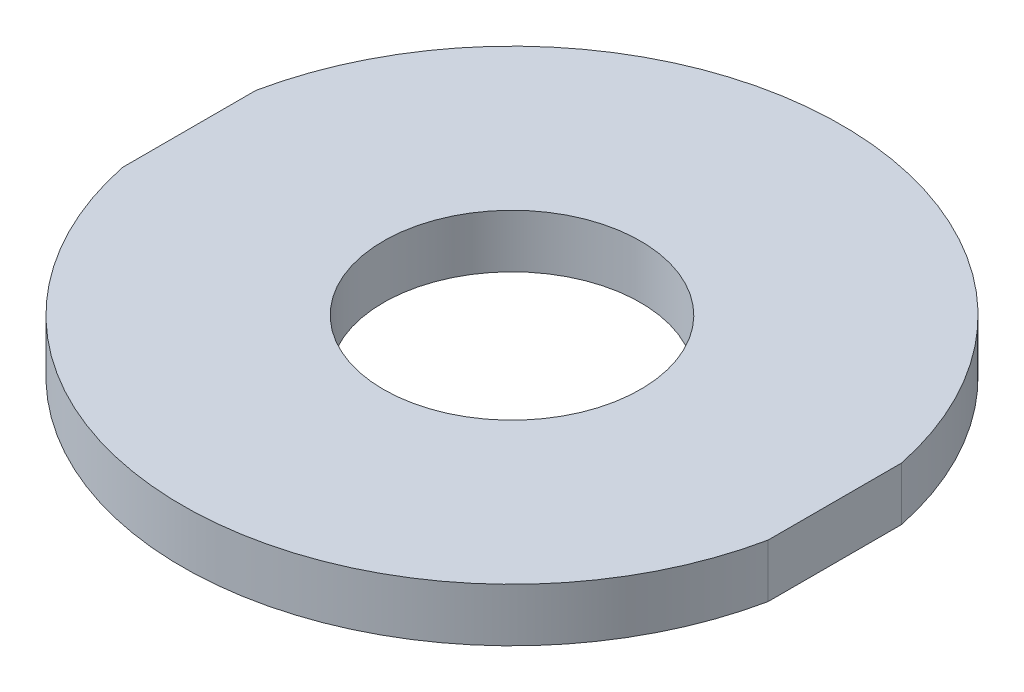
ISO-10303-21;
HEADER;
FILE_DESCRIPTION(('STEP AP214'),'2;1');
FILE_NAME('part.step','',(''),(''),'','','');
FILE_SCHEMA(('AUTOMOTIVE_DESIGN { 1 0 10303 214 1 1 1 1 }'));
ENDSEC;
DATA;
#1=APPLICATION_CONTEXT('core data for automotive mechanical design processes');
#2=APPLICATION_PROTOCOL_DEFINITION('international standard','automotive_design',2000,#1);
#3=PRODUCT_CONTEXT('',#1,'mechanical');
#4=PRODUCT('Part','Part','',(#3));
#5=PRODUCT_RELATED_PRODUCT_CATEGORY('part','',(#4));
#6=PRODUCT_DEFINITION_FORMATION('','',#4);
#7=PRODUCT_DEFINITION_CONTEXT('part definition',#1,'design');
#8=PRODUCT_DEFINITION('design','',#6,#7);
#9=PRODUCT_DEFINITION_SHAPE('','',#8);
#10=(LENGTH_UNIT() NAMED_UNIT(*) SI_UNIT(.MILLI.,.METRE.));
#11=(NAMED_UNIT(*) PLANE_ANGLE_UNIT() SI_UNIT($,.RADIAN.));
#12=(NAMED_UNIT(*) SI_UNIT($,.STERADIAN.) SOLID_ANGLE_UNIT());
#13=UNCERTAINTY_MEASURE_WITH_UNIT(LENGTH_MEASURE(1.E-05),#10,'distance_accuracy_value','');
#14=(GEOMETRIC_REPRESENTATION_CONTEXT(3) GLOBAL_UNCERTAINTY_ASSIGNED_CONTEXT((#13)) GLOBAL_UNIT_ASSIGNED_CONTEXT((#10,
#11,#12)) REPRESENTATION_CONTEXT('',''));
#15=CARTESIAN_POINT('',(0.,0.,0.));
#16=DIRECTION('',(0.,0.,1.));
#17=DIRECTION('',(1.,0.,0.));
#18=AXIS2_PLACEMENT_3D('',#15,#16,#17);
#19=CARTESIAN_POINT('',(-29.4584727390338,10.,1.69765412213651));
#20=DIRECTION('',(0.,1.,0.));
#21=DIRECTION('',(0.,0.,1.));
#22=AXIS2_PLACEMENT_3D('',#19,#20,#21);
#23=PLANE('',#22);
#24=CARTESIAN_POINT('',(-29.4584727390338,10.,1.69765412213651));
#25=DIRECTION('',(0.,1.,0.));
#26=DIRECTION('',(0.,0.,1.));
#27=AXIS2_PLACEMENT_3D('',#24,#25,#26);
#28=CIRCLE('',#27,61.8170061942196);
#29=CARTESIAN_POINT('',(31.0815326690944,10.,-10.8023458778632));
#30=VERTEX_POINT('',#29);
#31=CARTESIAN_POINT('',(-89.9984781471618,10.,-10.8023458778642));
#32=VERTEX_POINT('',#31);
#33=EDGE_CURVE('E86',#30,#32,#28,.T.);
#34=ORIENTED_EDGE('',*,*,#33,.T.);
#35=DIRECTION('',(0.,0.,1.));
#36=VECTOR('',#35,1.);
#37=CARTESIAN_POINT('',(-89.9984781471618,10.,-10.8023458778642));
#38=LINE('',#37,#36);
#39=CARTESIAN_POINT('',(-89.998478147162,10.,14.1976541221359));
#40=VERTEX_POINT('',#39);
#41=EDGE_CURVE('E81',#32,#40,#38,.T.);
#42=ORIENTED_EDGE('',*,*,#41,.T.);
#43=CARTESIAN_POINT('',(-29.4584727390338,10.,1.69765412213651));
#44=DIRECTION('',(0.,1.,0.));
#45=DIRECTION('',(0.,0.,1.));
#46=AXIS2_PLACEMENT_3D('',#43,#44,#45);
#47=CIRCLE('',#46,61.8170061942195);
#48=CARTESIAN_POINT('',(31.0815326690941,10.,14.1976541221375));
#49=VERTEX_POINT('',#48);
#50=EDGE_CURVE('E84',#40,#49,#47,.T.);
#51=ORIENTED_EDGE('',*,*,#50,.T.);
#52=DIRECTION('',(0.,0.,-1.));
#53=VECTOR('',#52,1.);
#54=CARTESIAN_POINT('',(31.0815326690944,10.,-10.8023458778632));
#55=LINE('',#54,#53);
#56=EDGE_CURVE('E51',#49,#30,#55,.T.);
#57=ORIENTED_EDGE('',*,*,#56,.T.);
#58=EDGE_LOOP('',(#34,#42,#51,#57));
#59=FACE_BOUND('',#58,.T.);
#60=CARTESIAN_POINT('',(-29.4584727390338,10.,1.69765412213651));
#61=DIRECTION('',(0.,1.,0.));
#62=DIRECTION('',(0.,0.,1.));
#63=AXIS2_PLACEMENT_3D('',#60,#61,#62);
#64=CIRCLE('',#63,24.116);
#65=CARTESIAN_POINT('',(-29.4584727390338,10.,25.8136541221365));
#66=VERTEX_POINT('',#65);
#67=EDGE_CURVE('E101',#66,#66,#64,.T.);
#68=ORIENTED_EDGE('',*,*,#67,.F.);
#69=EDGE_LOOP('',(#68));
#70=FACE_BOUND('',#69,.T.);
#71=ADVANCED_FACE('F34',(#59,#70),#23,.T.);
#72=CARTESIAN_POINT('',(-29.4584727390338,0.,1.69765412213651));
#73=DIRECTION('',(0.,1.,0.));
#74=DIRECTION('',(0.,0.,1.));
#75=AXIS2_PLACEMENT_3D('',#72,#73,#74);
#76=PLANE('',#75);
#77=CARTESIAN_POINT('',(-29.4584727390338,0.,1.69765412213651));
#78=DIRECTION('',(0.,1.,0.));
#79=DIRECTION('',(0.,0.,1.));
#80=AXIS2_PLACEMENT_3D('',#77,#78,#79);
#81=CIRCLE('',#80,61.8170061942196);
#82=CARTESIAN_POINT('',(31.0815326690944,0.,-10.8023458778632));
#83=VERTEX_POINT('',#82);
#84=CARTESIAN_POINT('',(-89.9984781471618,0.,-10.8023458778642));
#85=VERTEX_POINT('',#84);
#86=EDGE_CURVE('E98',#83,#85,#81,.T.);
#87=ORIENTED_EDGE('',*,*,#86,.F.);
#88=DIRECTION('',(0.,0.,-1.));
#89=VECTOR('',#88,1.);
#90=CARTESIAN_POINT('',(31.0815326690944,0.,-10.8023458778632));
#91=LINE('',#90,#89);
#92=CARTESIAN_POINT('',(31.0815326690941,0.,14.1976541221375));
#93=VERTEX_POINT('',#92);
#94=EDGE_CURVE('E74',#93,#83,#91,.T.);
#95=ORIENTED_EDGE('',*,*,#94,.F.);
#96=CARTESIAN_POINT('',(-29.4584727390338,0.,1.69765412213651));
#97=DIRECTION('',(0.,1.,0.));
#98=DIRECTION('',(0.,0.,1.));
#99=AXIS2_PLACEMENT_3D('',#96,#97,#98);
#100=CIRCLE('',#99,61.8170061942195);
#101=CARTESIAN_POINT('',(-89.998478147162,0.,14.1976541221359));
#102=VERTEX_POINT('',#101);
#103=EDGE_CURVE('E68',#102,#93,#100,.T.);
#104=ORIENTED_EDGE('',*,*,#103,.F.);
#105=DIRECTION('',(0.,0.,1.));
#106=VECTOR('',#105,1.);
#107=CARTESIAN_POINT('',(-89.9984781471618,0.,-10.8023458778642));
#108=LINE('',#107,#106);
#109=EDGE_CURVE('E90',#85,#102,#108,.T.);
#110=ORIENTED_EDGE('',*,*,#109,.F.);
#111=EDGE_LOOP('',(#87,#95,#104,#110));
#112=FACE_BOUND('',#111,.T.);
#113=CARTESIAN_POINT('',(-29.4584727390338,0.,1.69765412213651));
#114=DIRECTION('',(0.,1.,0.));
#115=DIRECTION('',(0.,0.,1.));
#116=AXIS2_PLACEMENT_3D('',#113,#114,#115);
#117=CIRCLE('',#116,24.116);
#118=CARTESIAN_POINT('',(-29.4584727390338,0.,25.8136541221365));
#119=VERTEX_POINT('',#118);
#120=EDGE_CURVE('E113',#119,#119,#117,.T.);
#121=ORIENTED_EDGE('',*,*,#120,.T.);
#122=EDGE_LOOP('',(#121));
#123=FACE_BOUND('',#122,.T.);
#124=ADVANCED_FACE('F109',(#112,#123),#76,.F.);
#125=CARTESIAN_POINT('',(-29.4584727390338,10.,1.69765412213651));
#126=DIRECTION('',(0.,-1.,0.));
#127=DIRECTION('',(0.,0.,-1.));
#128=AXIS2_PLACEMENT_3D('',#125,#126,#127);
#129=CYLINDRICAL_SURFACE('',#128,61.8170061942196);
#130=ORIENTED_EDGE('',*,*,#86,.T.);
#131=DIRECTION('',(0.,-1.,0.));
#132=VECTOR('',#131,1.);
#133=CARTESIAN_POINT('',(-89.9984781471618,10.,-10.8023458778642));
#134=LINE('',#133,#132);
#135=EDGE_CURVE('E11',#32,#85,#134,.T.);
#136=ORIENTED_EDGE('',*,*,#135,.F.);
#137=ORIENTED_EDGE('',*,*,#33,.F.);
#138=DIRECTION('',(0.,-1.,0.));
#139=VECTOR('',#138,1.);
#140=CARTESIAN_POINT('',(31.0815326690944,10.,-10.8023458778632));
#141=LINE('',#140,#139);
#142=EDGE_CURVE('E94',#30,#83,#141,.T.);
#143=ORIENTED_EDGE('',*,*,#142,.T.);
#144=EDGE_LOOP('',(#130,#136,#137,#143));
#145=FACE_BOUND('',#144,.T.);
#146=ADVANCED_FACE('F36',(#145),#129,.T.);
#147=CARTESIAN_POINT('',(-89.9984781471618,10.,-10.8023458778642));
#148=DIRECTION('',(1.,0.,0.));
#149=DIRECTION('',(0.,0.,-1.));
#150=AXIS2_PLACEMENT_3D('',#147,#148,#149);
#151=PLANE('',#150);
#152=ORIENTED_EDGE('',*,*,#109,.T.);
#153=DIRECTION('',(0.,-1.,0.));
#154=VECTOR('',#153,1.);
#155=CARTESIAN_POINT('',(-89.998478147162,10.,14.1976541221359));
#156=LINE('',#155,#154);
#157=EDGE_CURVE('E43',#40,#102,#156,.T.);
#158=ORIENTED_EDGE('',*,*,#157,.F.);
#159=ORIENTED_EDGE('',*,*,#41,.F.);
#160=ORIENTED_EDGE('',*,*,#135,.T.);
#161=EDGE_LOOP('',(#152,#158,#159,#160));
#162=FACE_BOUND('',#161,.T.);
#163=ADVANCED_FACE('F89',(#162),#151,.F.);
#164=CARTESIAN_POINT('',(-29.4584727390338,10.,1.69765412213651));
#165=DIRECTION('',(0.,-1.,0.));
#166=DIRECTION('',(0.,0.,-1.));
#167=AXIS2_PLACEMENT_3D('',#164,#165,#166);
#168=CYLINDRICAL_SURFACE('',#167,61.8170061942195);
#169=ORIENTED_EDGE('',*,*,#103,.T.);
#170=DIRECTION('',(0.,-1.,0.));
#171=VECTOR('',#170,1.);
#172=CARTESIAN_POINT('',(31.0815326690941,10.,14.1976541221375));
#173=LINE('',#172,#171);
#174=EDGE_CURVE('E91',#49,#93,#173,.T.);
#175=ORIENTED_EDGE('',*,*,#174,.F.);
#176=ORIENTED_EDGE('',*,*,#50,.F.);
#177=ORIENTED_EDGE('',*,*,#157,.T.);
#178=EDGE_LOOP('',(#169,#175,#176,#177));
#179=FACE_BOUND('',#178,.T.);
#180=ADVANCED_FACE('F92',(#179),#168,.T.);
#181=CARTESIAN_POINT('',(31.0815326690944,10.,-10.8023458778632));
#182=DIRECTION('',(-1.,0.,0.));
#183=DIRECTION('',(0.,0.,1.));
#184=AXIS2_PLACEMENT_3D('',#181,#182,#183);
#185=PLANE('',#184);
#186=ORIENTED_EDGE('',*,*,#94,.T.);
#187=ORIENTED_EDGE('',*,*,#142,.F.);
#188=ORIENTED_EDGE('',*,*,#56,.F.);
#189=ORIENTED_EDGE('',*,*,#174,.T.);
#190=EDGE_LOOP('',(#186,#187,#188,#189));
#191=FACE_BOUND('',#190,.T.);
#192=ADVANCED_FACE('F106',(#191),#185,.F.);
#193=CARTESIAN_POINT('',(-29.4584727390338,10.,1.69765412213651));
#194=DIRECTION('',(0.,-1.,0.));
#195=DIRECTION('',(0.,0.,-1.));
#196=AXIS2_PLACEMENT_3D('',#193,#194,#195);
#197=CYLINDRICAL_SURFACE('',#196,24.116);
#198=ORIENTED_EDGE('',*,*,#67,.T.);
#199=EDGE_LOOP('',(#198));
#200=FACE_BOUND('',#199,.T.);
#201=ORIENTED_EDGE('',*,*,#120,.F.);
#202=EDGE_LOOP('',(#201));
#203=FACE_BOUND('',#202,.T.);
#204=ADVANCED_FACE('F119',(#200,#203),#197,.F.);
#205=CLOSED_SHELL('',(#71,#124,#146,#163,#180,#192,#204));
#206=MANIFOLD_SOLID_BREP('B2',#205);
#207=ADVANCED_BREP_SHAPE_REPRESENTATION('',(#18,#206),#14);
#208=SHAPE_DEFINITION_REPRESENTATION(#9,#207);
ENDSEC;
END-ISO-10303-21;
